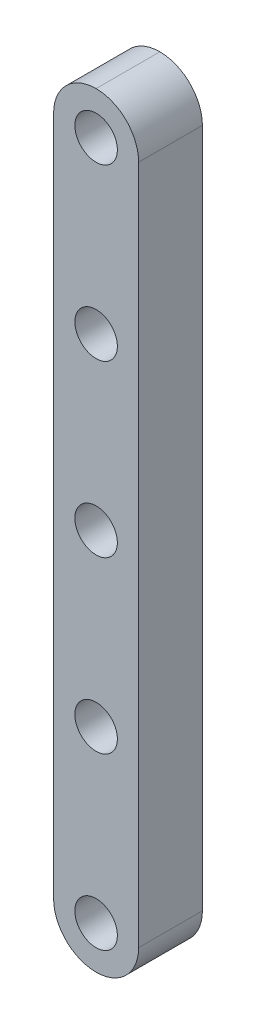
ISO-10303-21;
HEADER;
FILE_DESCRIPTION(('STEP AP214'),'2;1');
FILE_NAME('part.step','',(''),(''),'','','');
FILE_SCHEMA(('AUTOMOTIVE_DESIGN { 1 0 10303 214 1 1 1 1 }'));
ENDSEC;
DATA;
#1=APPLICATION_CONTEXT('core data for automotive mechanical design processes');
#2=APPLICATION_PROTOCOL_DEFINITION('international standard','automotive_design',2000,#1);
#3=PRODUCT_CONTEXT('',#1,'mechanical');
#4=PRODUCT('Part','Part','',(#3));
#5=PRODUCT_RELATED_PRODUCT_CATEGORY('part','',(#4));
#6=PRODUCT_DEFINITION_FORMATION('','',#4);
#7=PRODUCT_DEFINITION_CONTEXT('part definition',#1,'design');
#8=PRODUCT_DEFINITION('design','',#6,#7);
#9=PRODUCT_DEFINITION_SHAPE('','',#8);
#10=(LENGTH_UNIT() NAMED_UNIT(*) SI_UNIT(.MILLI.,.METRE.));
#11=(NAMED_UNIT(*) PLANE_ANGLE_UNIT() SI_UNIT($,.RADIAN.));
#12=(NAMED_UNIT(*) SI_UNIT($,.STERADIAN.) SOLID_ANGLE_UNIT());
#13=UNCERTAINTY_MEASURE_WITH_UNIT(LENGTH_MEASURE(1.E-05),#10,'distance_accuracy_value','');
#14=(GEOMETRIC_REPRESENTATION_CONTEXT(3) GLOBAL_UNCERTAINTY_ASSIGNED_CONTEXT((#13)) GLOBAL_UNIT_ASSIGNED_CONTEXT((#10,
#11,#12)) REPRESENTATION_CONTEXT('',''));
#15=CARTESIAN_POINT('',(0.,0.,0.));
#16=DIRECTION('',(0.,0.,1.));
#17=DIRECTION('',(1.,0.,0.));
#18=AXIS2_PLACEMENT_3D('',#15,#16,#17);
#19=CARTESIAN_POINT('',(0.,0.,15.));
#20=DIRECTION('',(0.,0.,-1.));
#21=DIRECTION('',(-1.,0.,0.));
#22=AXIS2_PLACEMENT_3D('',#19,#20,#21);
#23=PLANE('',#22);
#24=DIRECTION('',(0.,-1.,0.));
#25=VECTOR('',#24,1.);
#26=CARTESIAN_POINT('',(-9.99999999999999,-90.,15.));
#27=LINE('',#26,#25);
#28=CARTESIAN_POINT('',(-9.99999999999999,79.9999999999999,15.));
#29=VERTEX_POINT('',#28);
#30=CARTESIAN_POINT('',(-9.99999999999999,-80.,15.));
#31=VERTEX_POINT('',#30);
#32=EDGE_CURVE('E162',#29,#31,#27,.T.);
#33=ORIENTED_EDGE('',*,*,#32,.T.);
#34=CARTESIAN_POINT('',(0.,-80.,15.));
#35=DIRECTION('',(0.,0.,-1.));
#36=DIRECTION('',(-1.,0.,0.));
#37=AXIS2_PLACEMENT_3D('',#34,#35,#36);
#38=CIRCLE('',#37,10.);
#39=CARTESIAN_POINT('',(0.,-90.,15.));
#40=VERTEX_POINT('',#39);
#41=EDGE_CURVE('E57',#31,#40,#38,.F.);
#42=ORIENTED_EDGE('',*,*,#41,.T.);
#43=CARTESIAN_POINT('',(0.,-80.,15.));
#44=DIRECTION('',(0.,0.,-1.));
#45=DIRECTION('',(-1.,0.,0.));
#46=AXIS2_PLACEMENT_3D('',#43,#44,#45);
#47=CIRCLE('',#46,10.);
#48=CARTESIAN_POINT('',(10.,-80.,15.));
#49=VERTEX_POINT('',#48);
#50=EDGE_CURVE('E139',#40,#49,#47,.F.);
#51=ORIENTED_EDGE('',*,*,#50,.T.);
#52=DIRECTION('',(0.,1.,0.));
#53=VECTOR('',#52,1.);
#54=CARTESIAN_POINT('',(10.,-90.,15.));
#55=LINE('',#54,#53);
#56=CARTESIAN_POINT('',(10.,79.9999999999999,15.));
#57=VERTEX_POINT('',#56);
#58=EDGE_CURVE('E99',#49,#57,#55,.T.);
#59=ORIENTED_EDGE('',*,*,#58,.T.);
#60=CARTESIAN_POINT('',(0.,80.,15.));
#61=DIRECTION('',(0.,0.,-1.));
#62=DIRECTION('',(-1.,0.,0.));
#63=AXIS2_PLACEMENT_3D('',#60,#61,#62);
#64=CIRCLE('',#63,10.);
#65=CARTESIAN_POINT('',(0.,90.,15.));
#66=VERTEX_POINT('',#65);
#67=EDGE_CURVE('E64',#57,#66,#64,.F.);
#68=ORIENTED_EDGE('',*,*,#67,.T.);
#69=CARTESIAN_POINT('',(0.,80.,15.));
#70=DIRECTION('',(0.,0.,-1.));
#71=DIRECTION('',(-1.,0.,0.));
#72=AXIS2_PLACEMENT_3D('',#69,#70,#71);
#73=CIRCLE('',#72,10.);
#74=EDGE_CURVE('E134',#66,#29,#73,.F.);
#75=ORIENTED_EDGE('',*,*,#74,.T.);
#76=EDGE_LOOP('',(#33,#42,#51,#59,#68,#75));
#77=FACE_BOUND('',#76,.T.);
#78=CARTESIAN_POINT('',(0.,-80.,15.));
#79=DIRECTION('',(0.,0.,1.));
#80=DIRECTION('',(1.,0.,0.));
#81=AXIS2_PLACEMENT_3D('',#78,#79,#80);
#82=CIRCLE('',#81,5.00000000000001);
#83=CARTESIAN_POINT('',(5.00000000000002,-80.,15.));
#84=VERTEX_POINT('',#83);
#85=EDGE_CURVE('E111',#84,#84,#82,.T.);
#86=ORIENTED_EDGE('',*,*,#85,.F.);
#87=EDGE_LOOP('',(#86));
#88=FACE_BOUND('',#87,.T.);
#89=CARTESIAN_POINT('',(0.,80.,15.));
#90=DIRECTION('',(0.,0.,1.));
#91=DIRECTION('',(-1.,0.,0.));
#92=AXIS2_PLACEMENT_3D('',#89,#90,#91);
#93=CIRCLE('',#92,5.);
#94=CARTESIAN_POINT('',(-4.99999999999999,80.,15.));
#95=VERTEX_POINT('',#94);
#96=EDGE_CURVE('E316',#95,#95,#93,.T.);
#97=ORIENTED_EDGE('',*,*,#96,.F.);
#98=EDGE_LOOP('',(#97));
#99=FACE_BOUND('',#98,.T.);
#100=CARTESIAN_POINT('',(0.,0.,15.));
#101=DIRECTION('',(0.,0.,1.));
#102=DIRECTION('',(1.,0.,0.));
#103=AXIS2_PLACEMENT_3D('',#100,#101,#102);
#104=CIRCLE('',#103,5.);
#105=CARTESIAN_POINT('',(5.,0.,15.));
#106=VERTEX_POINT('',#105);
#107=EDGE_CURVE('E308',#106,#106,#104,.T.);
#108=ORIENTED_EDGE('',*,*,#107,.F.);
#109=EDGE_LOOP('',(#108));
#110=FACE_BOUND('',#109,.T.);
#111=CARTESIAN_POINT('',(0.,40.,15.));
#112=DIRECTION('',(0.,0.,1.));
#113=DIRECTION('',(1.,0.,0.));
#114=AXIS2_PLACEMENT_3D('',#111,#112,#113);
#115=CIRCLE('',#114,5.);
#116=CARTESIAN_POINT('',(5.00000000000002,40.,15.));
#117=VERTEX_POINT('',#116);
#118=EDGE_CURVE('E301',#117,#117,#115,.T.);
#119=ORIENTED_EDGE('',*,*,#118,.F.);
#120=EDGE_LOOP('',(#119));
#121=FACE_BOUND('',#120,.T.);
#122=CARTESIAN_POINT('',(0.,-40.,15.));
#123=DIRECTION('',(0.,0.,1.));
#124=DIRECTION('',(1.,0.,0.));
#125=AXIS2_PLACEMENT_3D('',#122,#123,#124);
#126=CIRCLE('',#125,5.);
#127=CARTESIAN_POINT('',(5.00000000000001,-40.,15.));
#128=VERTEX_POINT('',#127);
#129=EDGE_CURVE('E151',#128,#128,#126,.T.);
#130=ORIENTED_EDGE('',*,*,#129,.F.);
#131=EDGE_LOOP('',(#130));
#132=FACE_BOUND('',#131,.T.);
#133=ADVANCED_FACE('F39',(#77,#88,#99,#110,#121,#132),#23,.F.);
#134=CARTESIAN_POINT('',(0.,0.,0.));
#135=DIRECTION('',(0.,0.,-1.));
#136=DIRECTION('',(-1.,0.,0.));
#137=AXIS2_PLACEMENT_3D('',#134,#135,#136);
#138=PLANE('',#137);
#139=CARTESIAN_POINT('',(0.,40.,0.));
#140=DIRECTION('',(0.,0.,1.));
#141=DIRECTION('',(1.,0.,0.));
#142=AXIS2_PLACEMENT_3D('',#139,#140,#141);
#143=CIRCLE('',#142,5.);
#144=CARTESIAN_POINT('',(5.00000000000002,40.,0.));
#145=VERTEX_POINT('',#144);
#146=EDGE_CURVE('E297',#145,#145,#143,.T.);
#147=ORIENTED_EDGE('',*,*,#146,.T.);
#148=EDGE_LOOP('',(#147));
#149=FACE_BOUND('',#148,.T.);
#150=CARTESIAN_POINT('',(0.,80.,0.));
#151=DIRECTION('',(0.,0.,1.));
#152=DIRECTION('',(-1.,0.,0.));
#153=AXIS2_PLACEMENT_3D('',#150,#151,#152);
#154=CIRCLE('',#153,5.);
#155=CARTESIAN_POINT('',(-4.99999999999999,80.,0.));
#156=VERTEX_POINT('',#155);
#157=EDGE_CURVE('E312',#156,#156,#154,.T.);
#158=ORIENTED_EDGE('',*,*,#157,.T.);
#159=EDGE_LOOP('',(#158));
#160=FACE_BOUND('',#159,.T.);
#161=CARTESIAN_POINT('',(0.,-80.,0.));
#162=DIRECTION('',(0.,0.,-1.));
#163=DIRECTION('',(-1.,0.,0.));
#164=AXIS2_PLACEMENT_3D('',#161,#162,#163);
#165=CIRCLE('',#164,10.);
#166=CARTESIAN_POINT('',(10.,-80.,0.));
#167=VERTEX_POINT('',#166);
#168=CARTESIAN_POINT('',(0.,-90.,0.));
#169=VERTEX_POINT('',#168);
#170=EDGE_CURVE('E105',#167,#169,#165,.T.);
#171=ORIENTED_EDGE('',*,*,#170,.T.);
#172=CARTESIAN_POINT('',(0.,-80.,0.));
#173=DIRECTION('',(0.,0.,-1.));
#174=DIRECTION('',(-1.,0.,0.));
#175=AXIS2_PLACEMENT_3D('',#172,#173,#174);
#176=CIRCLE('',#175,10.);
#177=CARTESIAN_POINT('',(-9.99999999999999,-80.,0.));
#178=VERTEX_POINT('',#177);
#179=EDGE_CURVE('E118',#169,#178,#176,.T.);
#180=ORIENTED_EDGE('',*,*,#179,.T.);
#181=DIRECTION('',(0.,-1.,0.));
#182=VECTOR('',#181,1.);
#183=CARTESIAN_POINT('',(-9.99999999999999,-90.,0.));
#184=LINE('',#183,#182);
#185=CARTESIAN_POINT('',(-9.99999999999999,79.9999999999999,0.));
#186=VERTEX_POINT('',#185);
#187=EDGE_CURVE('E110',#186,#178,#184,.T.);
#188=ORIENTED_EDGE('',*,*,#187,.F.);
#189=CARTESIAN_POINT('',(0.,80.,0.));
#190=DIRECTION('',(0.,0.,-1.));
#191=DIRECTION('',(-1.,0.,0.));
#192=AXIS2_PLACEMENT_3D('',#189,#190,#191);
#193=CIRCLE('',#192,10.);
#194=CARTESIAN_POINT('',(0.,90.,0.));
#195=VERTEX_POINT('',#194);
#196=EDGE_CURVE('E124',#186,#195,#193,.T.);
#197=ORIENTED_EDGE('',*,*,#196,.T.);
#198=CARTESIAN_POINT('',(0.,80.,0.));
#199=DIRECTION('',(0.,0.,-1.));
#200=DIRECTION('',(-1.,0.,0.));
#201=AXIS2_PLACEMENT_3D('',#198,#199,#200);
#202=CIRCLE('',#201,10.);
#203=CARTESIAN_POINT('',(10.,79.9999999999999,0.));
#204=VERTEX_POINT('',#203);
#205=EDGE_CURVE('E108',#195,#204,#202,.T.);
#206=ORIENTED_EDGE('',*,*,#205,.T.);
#207=DIRECTION('',(0.,1.,0.));
#208=VECTOR('',#207,1.);
#209=CARTESIAN_POINT('',(10.,-90.,0.));
#210=LINE('',#209,#208);
#211=EDGE_CURVE('E97',#167,#204,#210,.T.);
#212=ORIENTED_EDGE('',*,*,#211,.F.);
#213=EDGE_LOOP('',(#171,#180,#188,#197,#206,#212));
#214=FACE_BOUND('',#213,.T.);
#215=CARTESIAN_POINT('',(0.,-80.,0.));
#216=DIRECTION('',(0.,0.,1.));
#217=DIRECTION('',(1.,0.,0.));
#218=AXIS2_PLACEMENT_3D('',#215,#216,#217);
#219=CIRCLE('',#218,5.00000000000001);
#220=CARTESIAN_POINT('',(5.00000000000002,-80.,0.));
#221=VERTEX_POINT('',#220);
#222=EDGE_CURVE('E320',#221,#221,#219,.T.);
#223=ORIENTED_EDGE('',*,*,#222,.T.);
#224=EDGE_LOOP('',(#223));
#225=FACE_BOUND('',#224,.T.);
#226=CARTESIAN_POINT('',(0.,0.,0.));
#227=DIRECTION('',(0.,0.,1.));
#228=DIRECTION('',(1.,0.,0.));
#229=AXIS2_PLACEMENT_3D('',#226,#227,#228);
#230=CIRCLE('',#229,5.);
#231=CARTESIAN_POINT('',(5.,0.,0.));
#232=VERTEX_POINT('',#231);
#233=EDGE_CURVE('E306',#232,#232,#230,.T.);
#234=ORIENTED_EDGE('',*,*,#233,.T.);
#235=EDGE_LOOP('',(#234));
#236=FACE_BOUND('',#235,.T.);
#237=CARTESIAN_POINT('',(0.,-40.,0.));
#238=DIRECTION('',(0.,0.,1.));
#239=DIRECTION('',(1.,0.,0.));
#240=AXIS2_PLACEMENT_3D('',#237,#238,#239);
#241=CIRCLE('',#240,5.);
#242=CARTESIAN_POINT('',(5.00000000000001,-40.,0.));
#243=VERTEX_POINT('',#242);
#244=EDGE_CURVE('E146',#243,#243,#241,.T.);
#245=ORIENTED_EDGE('',*,*,#244,.T.);
#246=EDGE_LOOP('',(#245));
#247=FACE_BOUND('',#246,.T.);
#248=ADVANCED_FACE('F103',(#149,#160,#214,#225,#236,#247),#138,.T.);
#249=CARTESIAN_POINT('',(10.,-90.,15.));
#250=DIRECTION('',(-1.,0.,0.));
#251=DIRECTION('',(0.,0.,1.));
#252=AXIS2_PLACEMENT_3D('',#249,#250,#251);
#253=PLANE('',#252);
#254=ORIENTED_EDGE('',*,*,#58,.F.);
#255=DIRECTION('',(0.,0.,-1.));
#256=VECTOR('',#255,1.);
#257=CARTESIAN_POINT('',(10.,-80.,15.));
#258=LINE('',#257,#256);
#259=EDGE_CURVE('E11',#49,#167,#258,.T.);
#260=ORIENTED_EDGE('',*,*,#259,.T.);
#261=ORIENTED_EDGE('',*,*,#211,.T.);
#262=DIRECTION('',(0.,0.,-1.));
#263=VECTOR('',#262,1.);
#264=CARTESIAN_POINT('',(10.,80.,15.));
#265=LINE('',#264,#263);
#266=EDGE_CURVE('E49',#204,#57,#265,.F.);
#267=ORIENTED_EDGE('',*,*,#266,.T.);
#268=EDGE_LOOP('',(#254,#260,#261,#267));
#269=FACE_BOUND('',#268,.T.);
#270=ADVANCED_FACE('F95',(#269),#253,.F.);
#271=CARTESIAN_POINT('',(-9.99999999999999,-90.,15.));
#272=DIRECTION('',(1.,0.,0.));
#273=DIRECTION('',(0.,1.,0.));
#274=AXIS2_PLACEMENT_3D('',#271,#272,#273);
#275=PLANE('',#274);
#276=ORIENTED_EDGE('',*,*,#187,.T.);
#277=DIRECTION('',(0.,0.,-1.));
#278=VECTOR('',#277,1.);
#279=CARTESIAN_POINT('',(-9.99999999999999,-80.,15.));
#280=LINE('',#279,#278);
#281=EDGE_CURVE('E130',#178,#31,#280,.F.);
#282=ORIENTED_EDGE('',*,*,#281,.T.);
#283=ORIENTED_EDGE('',*,*,#32,.F.);
#284=DIRECTION('',(0.,0.,-1.));
#285=VECTOR('',#284,1.);
#286=CARTESIAN_POINT('',(-9.99999999999999,80.,15.));
#287=LINE('',#286,#285);
#288=EDGE_CURVE('E122',#29,#186,#287,.T.);
#289=ORIENTED_EDGE('',*,*,#288,.T.);
#290=EDGE_LOOP('',(#276,#282,#283,#289));
#291=FACE_BOUND('',#290,.T.);
#292=ADVANCED_FACE('F165',(#291),#275,.F.);
#293=CARTESIAN_POINT('',(0.,-80.,15.));
#294=DIRECTION('',(0.,0.,-1.));
#295=DIRECTION('',(-1.,0.,0.));
#296=AXIS2_PLACEMENT_3D('',#293,#294,#295);
#297=CYLINDRICAL_SURFACE('',#296,5.00000000000001);
#298=ORIENTED_EDGE('',*,*,#85,.T.);
#299=EDGE_LOOP('',(#298));
#300=FACE_BOUND('',#299,.T.);
#301=ORIENTED_EDGE('',*,*,#222,.F.);
#302=EDGE_LOOP('',(#301));
#303=FACE_BOUND('',#302,.T.);
#304=ADVANCED_FACE('F194',(#300,#303),#297,.F.);
#305=CARTESIAN_POINT('',(0.,80.,15.));
#306=DIRECTION('',(0.,0.,-1.));
#307=DIRECTION('',(-1.,0.,0.));
#308=AXIS2_PLACEMENT_3D('',#305,#306,#307);
#309=CYLINDRICAL_SURFACE('',#308,5.);
#310=ORIENTED_EDGE('',*,*,#96,.T.);
#311=EDGE_LOOP('',(#310));
#312=FACE_BOUND('',#311,.T.);
#313=ORIENTED_EDGE('',*,*,#157,.F.);
#314=EDGE_LOOP('',(#313));
#315=FACE_BOUND('',#314,.T.);
#316=ADVANCED_FACE('F214',(#312,#315),#309,.F.);
#317=CARTESIAN_POINT('',(0.,0.,15.));
#318=DIRECTION('',(0.,0.,-1.));
#319=DIRECTION('',(-1.,0.,0.));
#320=AXIS2_PLACEMENT_3D('',#317,#318,#319);
#321=CYLINDRICAL_SURFACE('',#320,5.);
#322=ORIENTED_EDGE('',*,*,#107,.T.);
#323=EDGE_LOOP('',(#322));
#324=FACE_BOUND('',#323,.T.);
#325=ORIENTED_EDGE('',*,*,#233,.F.);
#326=EDGE_LOOP('',(#325));
#327=FACE_BOUND('',#326,.T.);
#328=ADVANCED_FACE('F221',(#324,#327),#321,.F.);
#329=CARTESIAN_POINT('',(0.,40.,15.));
#330=DIRECTION('',(0.,0.,-1.));
#331=DIRECTION('',(-1.,0.,0.));
#332=AXIS2_PLACEMENT_3D('',#329,#330,#331);
#333=CYLINDRICAL_SURFACE('',#332,5.);
#334=ORIENTED_EDGE('',*,*,#118,.T.);
#335=EDGE_LOOP('',(#334));
#336=FACE_BOUND('',#335,.T.);
#337=ORIENTED_EDGE('',*,*,#146,.F.);
#338=EDGE_LOOP('',(#337));
#339=FACE_BOUND('',#338,.T.);
#340=ADVANCED_FACE('F228',(#336,#339),#333,.F.);
#341=CARTESIAN_POINT('',(0.,-40.,15.));
#342=DIRECTION('',(0.,0.,-1.));
#343=DIRECTION('',(-1.,0.,0.));
#344=AXIS2_PLACEMENT_3D('',#341,#342,#343);
#345=CYLINDRICAL_SURFACE('',#344,5.);
#346=ORIENTED_EDGE('',*,*,#129,.T.);
#347=EDGE_LOOP('',(#346));
#348=FACE_BOUND('',#347,.T.);
#349=ORIENTED_EDGE('',*,*,#244,.F.);
#350=EDGE_LOOP('',(#349));
#351=FACE_BOUND('',#350,.T.);
#352=ADVANCED_FACE('F183',(#348,#351),#345,.F.);
#353=CARTESIAN_POINT('',(0.,-80.,15.));
#354=DIRECTION('',(0.,0.,-1.));
#355=DIRECTION('',(-1.,0.,0.));
#356=AXIS2_PLACEMENT_3D('',#353,#354,#355);
#357=CYLINDRICAL_SURFACE('',#356,10.);
#358=ORIENTED_EDGE('',*,*,#259,.F.);
#359=ORIENTED_EDGE('',*,*,#50,.F.);
#360=DIRECTION('',(0.,0.,-1.));
#361=VECTOR('',#360,1.);
#362=CARTESIAN_POINT('',(0.,-90.,15.));
#363=LINE('',#362,#361);
#364=EDGE_CURVE('E115',#169,#40,#363,.F.);
#365=ORIENTED_EDGE('',*,*,#364,.F.);
#366=ORIENTED_EDGE('',*,*,#170,.F.);
#367=EDGE_LOOP('',(#358,#359,#365,#366));
#368=FACE_BOUND('',#367,.T.);
#369=ADVANCED_FACE('F113',(#368),#357,.T.);
#370=CARTESIAN_POINT('',(0.,-80.,15.));
#371=DIRECTION('',(0.,0.,-1.));
#372=DIRECTION('',(-1.,0.,0.));
#373=AXIS2_PLACEMENT_3D('',#370,#371,#372);
#374=CYLINDRICAL_SURFACE('',#373,10.);
#375=ORIENTED_EDGE('',*,*,#41,.F.);
#376=ORIENTED_EDGE('',*,*,#281,.F.);
#377=ORIENTED_EDGE('',*,*,#179,.F.);
#378=ORIENTED_EDGE('',*,*,#364,.T.);
#379=EDGE_LOOP('',(#375,#376,#377,#378));
#380=FACE_BOUND('',#379,.T.);
#381=ADVANCED_FACE('F176',(#380),#374,.T.);
#382=CARTESIAN_POINT('',(0.,80.,15.));
#383=DIRECTION('',(0.,0.,-1.));
#384=DIRECTION('',(-1.,0.,0.));
#385=AXIS2_PLACEMENT_3D('',#382,#383,#384);
#386=CYLINDRICAL_SURFACE('',#385,10.);
#387=ORIENTED_EDGE('',*,*,#288,.F.);
#388=ORIENTED_EDGE('',*,*,#74,.F.);
#389=DIRECTION('',(0.,0.,-1.));
#390=VECTOR('',#389,1.);
#391=CARTESIAN_POINT('',(0.,90.,15.));
#392=LINE('',#391,#390);
#393=EDGE_CURVE('E43',#195,#66,#392,.F.);
#394=ORIENTED_EDGE('',*,*,#393,.F.);
#395=ORIENTED_EDGE('',*,*,#196,.F.);
#396=EDGE_LOOP('',(#387,#388,#394,#395));
#397=FACE_BOUND('',#396,.T.);
#398=ADVANCED_FACE('F41',(#397),#386,.T.);
#399=CARTESIAN_POINT('',(0.,80.,15.));
#400=DIRECTION('',(0.,0.,-1.));
#401=DIRECTION('',(-1.,0.,0.));
#402=AXIS2_PLACEMENT_3D('',#399,#400,#401);
#403=CYLINDRICAL_SURFACE('',#402,10.);
#404=ORIENTED_EDGE('',*,*,#67,.F.);
#405=ORIENTED_EDGE('',*,*,#266,.F.);
#406=ORIENTED_EDGE('',*,*,#205,.F.);
#407=ORIENTED_EDGE('',*,*,#393,.T.);
#408=EDGE_LOOP('',(#404,#405,#406,#407));
#409=FACE_BOUND('',#408,.T.);
#410=ADVANCED_FACE('F156',(#409),#403,.T.);
#411=CLOSED_SHELL('',(#133,#248,#270,#292,#304,#316,#328,#340,#352,#369,#381,#398,#410));
#412=MANIFOLD_SOLID_BREP('B2',#411);
#413=ADVANCED_BREP_SHAPE_REPRESENTATION('',(#18,#412),#14);
#414=SHAPE_DEFINITION_REPRESENTATION(#9,#413);
ENDSEC;
END-ISO-10303-21;
